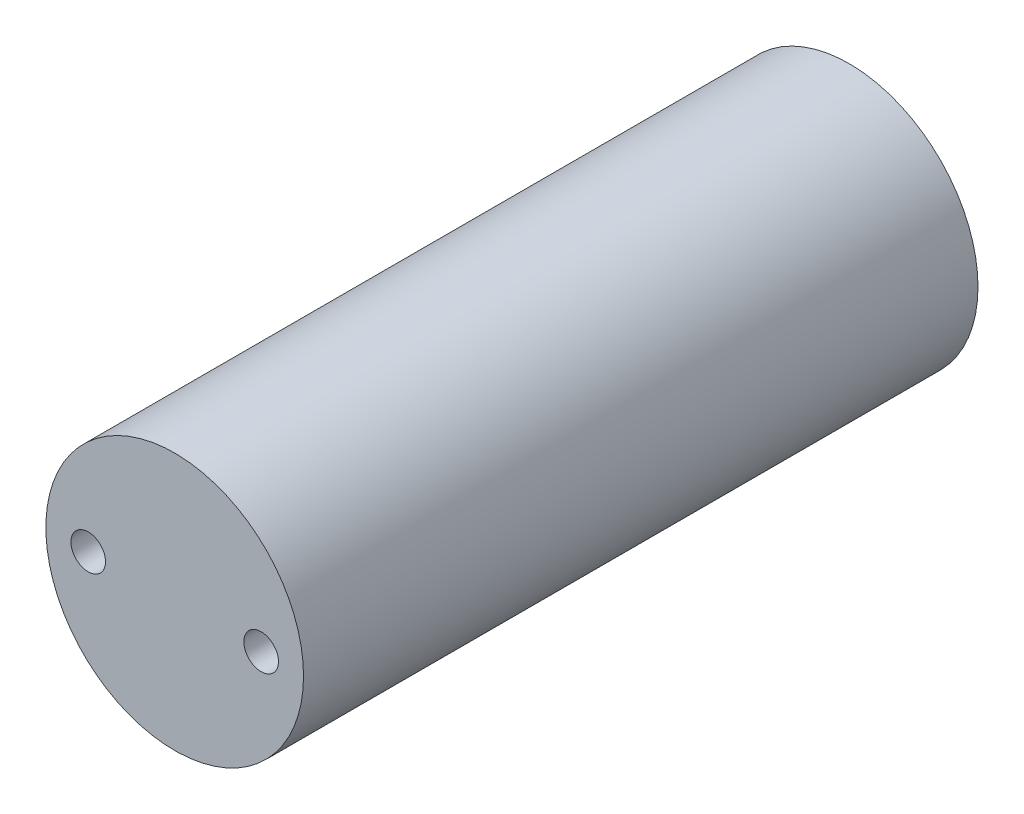
ISO-10303-21;
HEADER;
FILE_DESCRIPTION(('STEP AP214'),'2;1');
FILE_NAME('part.step','',(''),(''),'','','');
FILE_SCHEMA(('AUTOMOTIVE_DESIGN { 1 0 10303 214 1 1 1 1 }'));
ENDSEC;
DATA;
#1=APPLICATION_CONTEXT('core data for automotive mechanical design processes');
#2=APPLICATION_PROTOCOL_DEFINITION('international standard','automotive_design',2000,#1);
#3=PRODUCT_CONTEXT('',#1,'mechanical');
#4=PRODUCT('Part','Part','',(#3));
#5=PRODUCT_RELATED_PRODUCT_CATEGORY('part','',(#4));
#6=PRODUCT_DEFINITION_FORMATION('','',#4);
#7=PRODUCT_DEFINITION_CONTEXT('part definition',#1,'design');
#8=PRODUCT_DEFINITION('design','',#6,#7);
#9=PRODUCT_DEFINITION_SHAPE('','',#8);
#10=(LENGTH_UNIT() NAMED_UNIT(*) SI_UNIT(.MILLI.,.METRE.));
#11=(NAMED_UNIT(*) PLANE_ANGLE_UNIT() SI_UNIT($,.RADIAN.));
#12=(NAMED_UNIT(*) SI_UNIT($,.STERADIAN.) SOLID_ANGLE_UNIT());
#13=UNCERTAINTY_MEASURE_WITH_UNIT(LENGTH_MEASURE(1.E-05),#10,'distance_accuracy_value','');
#14=(GEOMETRIC_REPRESENTATION_CONTEXT(3) GLOBAL_UNCERTAINTY_ASSIGNED_CONTEXT((#13)) GLOBAL_UNIT_ASSIGNED_CONTEXT((#10,
#11,#12)) REPRESENTATION_CONTEXT('',''));
#15=CARTESIAN_POINT('',(0.,0.,0.));
#16=DIRECTION('',(0.,0.,1.));
#17=DIRECTION('',(1.,0.,0.));
#18=AXIS2_PLACEMENT_3D('',#15,#16,#17);
#19=CARTESIAN_POINT('',(0.,0.,39.));
#20=DIRECTION('',(0.,0.,1.));
#21=DIRECTION('',(1.,0.,0.));
#22=AXIS2_PLACEMENT_3D('',#19,#20,#21);
#23=PLANE('',#22);
#24=CARTESIAN_POINT('',(-5.,0.,39.));
#25=DIRECTION('',(0.,0.,1.));
#26=DIRECTION('',(1.,0.,0.));
#27=AXIS2_PLACEMENT_3D('',#24,#25,#26);
#28=CIRCLE('',#27,1.);
#29=CARTESIAN_POINT('',(-4.,0.,39.));
#30=VERTEX_POINT('',#29);
#31=EDGE_CURVE('E48',#30,#30,#28,.T.);
#32=ORIENTED_EDGE('',*,*,#31,.F.);
#33=EDGE_LOOP('',(#32));
#34=FACE_BOUND('',#33,.T.);
#35=CARTESIAN_POINT('',(0.,0.,39.));
#36=DIRECTION('',(0.,0.,1.));
#37=DIRECTION('',(1.,0.,0.));
#38=AXIS2_PLACEMENT_3D('',#35,#36,#37);
#39=CIRCLE('',#38,7.45);
#40=CARTESIAN_POINT('',(7.45,0.,39.));
#41=VERTEX_POINT('',#40);
#42=EDGE_CURVE('E10',#41,#41,#39,.T.);
#43=ORIENTED_EDGE('',*,*,#42,.T.);
#44=EDGE_LOOP('',(#43));
#45=FACE_BOUND('',#44,.T.);
#46=CARTESIAN_POINT('',(5.,0.,39.));
#47=DIRECTION('',(0.,0.,1.));
#48=DIRECTION('',(1.,0.,0.));
#49=AXIS2_PLACEMENT_3D('',#46,#47,#48);
#50=CIRCLE('',#49,1.);
#51=CARTESIAN_POINT('',(6.,0.,39.));
#52=VERTEX_POINT('',#51);
#53=EDGE_CURVE('E53',#52,#52,#50,.T.);
#54=ORIENTED_EDGE('',*,*,#53,.F.);
#55=EDGE_LOOP('',(#54));
#56=FACE_BOUND('',#55,.T.);
#57=ADVANCED_FACE('F37',(#34,#45,#56),#23,.T.);
#58=CARTESIAN_POINT('',(0.,0.,0.));
#59=DIRECTION('',(0.,0.,1.));
#60=DIRECTION('',(1.,0.,0.));
#61=AXIS2_PLACEMENT_3D('',#58,#59,#60);
#62=PLANE('',#61);
#63=CARTESIAN_POINT('',(0.,0.,0.));
#64=DIRECTION('',(0.,0.,1.));
#65=DIRECTION('',(1.,0.,0.));
#66=AXIS2_PLACEMENT_3D('',#63,#64,#65);
#67=CIRCLE('',#66,7.45);
#68=CARTESIAN_POINT('',(7.45,0.,0.));
#69=VERTEX_POINT('',#68);
#70=EDGE_CURVE('E41',#69,#69,#67,.T.);
#71=ORIENTED_EDGE('',*,*,#70,.F.);
#72=EDGE_LOOP('',(#71));
#73=FACE_BOUND('',#72,.T.);
#74=CARTESIAN_POINT('',(-5.,0.,0.));
#75=DIRECTION('',(0.,0.,1.));
#76=DIRECTION('',(1.,0.,0.));
#77=AXIS2_PLACEMENT_3D('',#74,#75,#76);
#78=CIRCLE('',#77,1.);
#79=CARTESIAN_POINT('',(-4.,0.,0.));
#80=VERTEX_POINT('',#79);
#81=EDGE_CURVE('E50',#80,#80,#78,.T.);
#82=ORIENTED_EDGE('',*,*,#81,.T.);
#83=EDGE_LOOP('',(#82));
#84=FACE_BOUND('',#83,.T.);
#85=CARTESIAN_POINT('',(5.,0.,0.));
#86=DIRECTION('',(0.,0.,1.));
#87=DIRECTION('',(1.,0.,0.));
#88=AXIS2_PLACEMENT_3D('',#85,#86,#87);
#89=CIRCLE('',#88,1.);
#90=CARTESIAN_POINT('',(6.,0.,0.));
#91=VERTEX_POINT('',#90);
#92=EDGE_CURVE('E56',#91,#91,#89,.T.);
#93=ORIENTED_EDGE('',*,*,#92,.T.);
#94=EDGE_LOOP('',(#93));
#95=FACE_BOUND('',#94,.T.);
#96=ADVANCED_FACE('F66',(#73,#84,#95),#62,.F.);
#97=CARTESIAN_POINT('',(0.,0.,39.));
#98=DIRECTION('',(0.,0.,-1.));
#99=DIRECTION('',(-1.,0.,0.));
#100=AXIS2_PLACEMENT_3D('',#97,#98,#99);
#101=CYLINDRICAL_SURFACE('',#100,7.45);
#102=ORIENTED_EDGE('',*,*,#42,.F.);
#103=EDGE_LOOP('',(#102));
#104=FACE_BOUND('',#103,.T.);
#105=ORIENTED_EDGE('',*,*,#70,.T.);
#106=EDGE_LOOP('',(#105));
#107=FACE_BOUND('',#106,.T.);
#108=ADVANCED_FACE('F39',(#104,#107),#101,.T.);
#109=CARTESIAN_POINT('',(-5.,0.,39.));
#110=DIRECTION('',(0.,0.,-1.));
#111=DIRECTION('',(-1.,0.,0.));
#112=AXIS2_PLACEMENT_3D('',#109,#110,#111);
#113=CYLINDRICAL_SURFACE('',#112,1.);
#114=ORIENTED_EDGE('',*,*,#31,.T.);
#115=EDGE_LOOP('',(#114));
#116=FACE_BOUND('',#115,.T.);
#117=ORIENTED_EDGE('',*,*,#81,.F.);
#118=EDGE_LOOP('',(#117));
#119=FACE_BOUND('',#118,.T.);
#120=ADVANCED_FACE('F75',(#116,#119),#113,.F.);
#121=CARTESIAN_POINT('',(5.,0.,39.));
#122=DIRECTION('',(0.,0.,-1.));
#123=DIRECTION('',(-1.,0.,0.));
#124=AXIS2_PLACEMENT_3D('',#121,#122,#123);
#125=CYLINDRICAL_SURFACE('',#124,1.);
#126=ORIENTED_EDGE('',*,*,#53,.T.);
#127=EDGE_LOOP('',(#126));
#128=FACE_BOUND('',#127,.T.);
#129=ORIENTED_EDGE('',*,*,#92,.F.);
#130=EDGE_LOOP('',(#129));
#131=FACE_BOUND('',#130,.T.);
#132=ADVANCED_FACE('F62',(#128,#131),#125,.F.);
#133=CLOSED_SHELL('',(#57,#96,#108,#120,#132));
#134=MANIFOLD_SOLID_BREP('B2',#133);
#135=ADVANCED_BREP_SHAPE_REPRESENTATION('',(#18,#134),#14);
#136=SHAPE_DEFINITION_REPRESENTATION(#9,#135);
ENDSEC;
END-ISO-10303-21;
